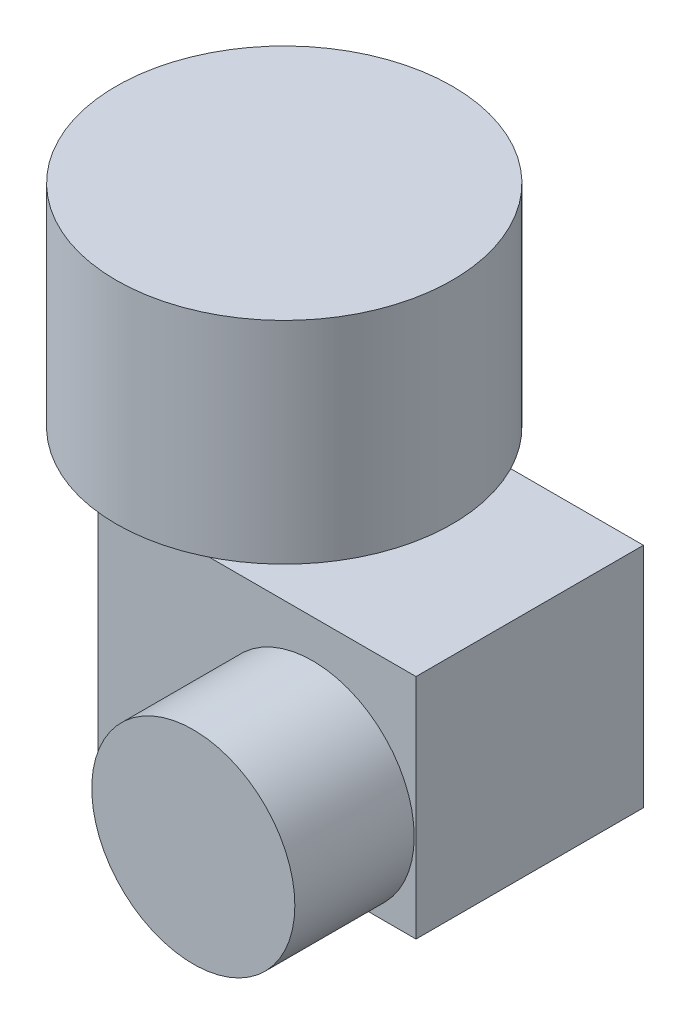
ISO-10303-21;
HEADER;
FILE_DESCRIPTION(('STEP AP214'),'2;1');
FILE_NAME('part.step','',(''),(''),'','','');
FILE_SCHEMA(('AUTOMOTIVE_DESIGN { 1 0 10303 214 1 1 1 1 }'));
ENDSEC;
DATA;
#1=APPLICATION_CONTEXT('core data for automotive mechanical design processes');
#2=APPLICATION_PROTOCOL_DEFINITION('international standard','automotive_design',2000,#1);
#3=PRODUCT_CONTEXT('',#1,'mechanical');
#4=PRODUCT('Part','Part','',(#3));
#5=PRODUCT_RELATED_PRODUCT_CATEGORY('part','',(#4));
#6=PRODUCT_DEFINITION_FORMATION('','',#4);
#7=PRODUCT_DEFINITION_CONTEXT('part definition',#1,'design');
#8=PRODUCT_DEFINITION('design','',#6,#7);
#9=PRODUCT_DEFINITION_SHAPE('','',#8);
#10=(LENGTH_UNIT() NAMED_UNIT(*) SI_UNIT(.MILLI.,.METRE.));
#11=(NAMED_UNIT(*) PLANE_ANGLE_UNIT() SI_UNIT($,.RADIAN.));
#12=(NAMED_UNIT(*) SI_UNIT($,.STERADIAN.) SOLID_ANGLE_UNIT());
#13=UNCERTAINTY_MEASURE_WITH_UNIT(LENGTH_MEASURE(1.E-05),#10,'distance_accuracy_value','');
#14=(GEOMETRIC_REPRESENTATION_CONTEXT(3) GLOBAL_UNCERTAINTY_ASSIGNED_CONTEXT((#13)) GLOBAL_UNIT_ASSIGNED_CONTEXT((#10,
#11,#12)) REPRESENTATION_CONTEXT('',''));
#15=CARTESIAN_POINT('',(0.,0.,0.));
#16=DIRECTION('',(0.,0.,1.));
#17=DIRECTION('',(1.,0.,0.));
#18=AXIS2_PLACEMENT_3D('',#15,#16,#17);
#19=CARTESIAN_POINT('',(-31.242,0.,0.));
#20=DIRECTION('',(0.,0.,1.));
#21=DIRECTION('',(1.,0.,0.));
#22=AXIS2_PLACEMENT_3D('',#19,#20,#21);
#23=PLANE('',#22);
#24=CARTESIAN_POINT('',(-7.62,11.176,0.));
#25=DIRECTION('',(0.,0.,1.));
#26=DIRECTION('',(1.,0.,0.));
#27=AXIS2_PLACEMENT_3D('',#24,#25,#26);
#28=CIRCLE('',#27,6.35);
#29=CARTESIAN_POINT('',(-1.27,11.176,0.));
#30=VERTEX_POINT('',#29);
#31=EDGE_CURVE('E11',#30,#30,#28,.T.);
#32=ORIENTED_EDGE('',*,*,#31,.F.);
#33=EDGE_LOOP('',(#32));
#34=FACE_BOUND('',#33,.T.);
#35=DIRECTION('',(0.,-1.,0.));
#36=VECTOR('',#35,1.);
#37=CARTESIAN_POINT('',(0.,0.,0.));
#38=LINE('',#37,#36);
#39=CARTESIAN_POINT('',(0.,22.352,0.));
#40=VERTEX_POINT('',#39);
#41=CARTESIAN_POINT('',(0.,0.,0.));
#42=VERTEX_POINT('',#41);
#43=EDGE_CURVE('E175',#40,#42,#38,.T.);
#44=ORIENTED_EDGE('',*,*,#43,.F.);
#45=DIRECTION('',(1.,0.,0.));
#46=VECTOR('',#45,1.);
#47=CARTESIAN_POINT('',(-31.242,22.352,0.));
#48=LINE('',#47,#46);
#49=CARTESIAN_POINT('',(-31.242,22.352,0.));
#50=VERTEX_POINT('',#49);
#51=EDGE_CURVE('E58',#50,#40,#48,.T.);
#52=ORIENTED_EDGE('',*,*,#51,.F.);
#53=DIRECTION('',(0.,-1.,0.));
#54=VECTOR('',#53,1.);
#55=CARTESIAN_POINT('',(-31.242,0.,0.));
#56=LINE('',#55,#54);
#57=CARTESIAN_POINT('',(-31.242,0.,0.));
#58=VERTEX_POINT('',#57);
#59=EDGE_CURVE('E179',#50,#58,#56,.T.);
#60=ORIENTED_EDGE('',*,*,#59,.T.);
#61=DIRECTION('',(1.,0.,0.));
#62=VECTOR('',#61,1.);
#63=CARTESIAN_POINT('',(-31.242,0.,0.));
#64=LINE('',#63,#62);
#65=EDGE_CURVE('E42',#58,#42,#64,.T.);
#66=ORIENTED_EDGE('',*,*,#65,.T.);
#67=EDGE_LOOP('',(#44,#52,#60,#66));
#68=FACE_BOUND('',#67,.T.);
#69=ADVANCED_FACE('F39',(#34,#68),#23,.T.);
#70=CARTESIAN_POINT('',(-31.242,22.352,0.));
#71=DIRECTION('',(0.,1.,0.));
#72=DIRECTION('',(0.,0.,1.));
#73=AXIS2_PLACEMENT_3D('',#70,#71,#72);
#74=PLANE('',#73);
#75=CARTESIAN_POINT('',(-24.13,22.352,-11.176));
#76=DIRECTION('',(0.,1.,0.));
#77=DIRECTION('',(0.,0.,1.));
#78=AXIS2_PLACEMENT_3D('',#75,#76,#77);
#79=CIRCLE('',#78,3.81);
#80=CARTESIAN_POINT('',(-24.13,22.352,-7.366));
#81=VERTEX_POINT('',#80);
#82=EDGE_CURVE('E170',#81,#81,#79,.T.);
#83=ORIENTED_EDGE('',*,*,#82,.F.);
#84=EDGE_LOOP('',(#83));
#85=FACE_BOUND('',#84,.T.);
#86=DIRECTION('',(0.,0.,1.));
#87=VECTOR('',#86,1.);
#88=CARTESIAN_POINT('',(0.,22.352,0.));
#89=LINE('',#88,#87);
#90=CARTESIAN_POINT('',(0.,22.352,-22.352));
#91=VERTEX_POINT('',#90);
#92=EDGE_CURVE('E183',#91,#40,#89,.T.);
#93=ORIENTED_EDGE('',*,*,#92,.F.);
#94=DIRECTION('',(1.,0.,0.));
#95=VECTOR('',#94,1.);
#96=CARTESIAN_POINT('',(-31.242,22.352,-22.352));
#97=LINE('',#96,#95);
#98=CARTESIAN_POINT('',(-31.242,22.352,-22.352));
#99=VERTEX_POINT('',#98);
#100=EDGE_CURVE('E76',#99,#91,#97,.T.);
#101=ORIENTED_EDGE('',*,*,#100,.F.);
#102=DIRECTION('',(0.,0.,1.));
#103=VECTOR('',#102,1.);
#104=CARTESIAN_POINT('',(-31.242,22.352,0.));
#105=LINE('',#104,#103);
#106=EDGE_CURVE('E189',#99,#50,#105,.T.);
#107=ORIENTED_EDGE('',*,*,#106,.T.);
#108=ORIENTED_EDGE('',*,*,#51,.T.);
#109=EDGE_LOOP('',(#93,#101,#107,#108));
#110=FACE_BOUND('',#109,.T.);
#111=ADVANCED_FACE('F214',(#85,#110),#74,.T.);
#112=CARTESIAN_POINT('',(-31.242,0.,-22.352));
#113=DIRECTION('',(0.,0.,-1.));
#114=DIRECTION('',(-1.,0.,0.));
#115=AXIS2_PLACEMENT_3D('',#112,#113,#114);
#116=PLANE('',#115);
#117=DIRECTION('',(0.,1.,0.));
#118=VECTOR('',#117,1.);
#119=CARTESIAN_POINT('',(0.,0.,-22.352));
#120=LINE('',#119,#118);
#121=CARTESIAN_POINT('',(0.,0.,-22.352));
#122=VERTEX_POINT('',#121);
#123=EDGE_CURVE('E199',#122,#91,#120,.T.);
#124=ORIENTED_EDGE('',*,*,#123,.F.);
#125=DIRECTION('',(1.,0.,0.));
#126=VECTOR('',#125,1.);
#127=CARTESIAN_POINT('',(-31.242,0.,-22.352));
#128=LINE('',#127,#126);
#129=CARTESIAN_POINT('',(-31.242,0.,-22.352));
#130=VERTEX_POINT('',#129);
#131=EDGE_CURVE('E208',#130,#122,#128,.T.);
#132=ORIENTED_EDGE('',*,*,#131,.F.);
#133=DIRECTION('',(0.,1.,0.));
#134=VECTOR('',#133,1.);
#135=CARTESIAN_POINT('',(-31.242,0.,-22.352));
#136=LINE('',#135,#134);
#137=EDGE_CURVE('E186',#130,#99,#136,.T.);
#138=ORIENTED_EDGE('',*,*,#137,.T.);
#139=ORIENTED_EDGE('',*,*,#100,.T.);
#140=EDGE_LOOP('',(#124,#132,#138,#139));
#141=FACE_BOUND('',#140,.T.);
#142=ADVANCED_FACE('F217',(#141),#116,.T.);
#143=CARTESIAN_POINT('',(-31.242,0.,0.));
#144=DIRECTION('',(0.,-1.,0.));
#145=DIRECTION('',(0.,0.,-1.));
#146=AXIS2_PLACEMENT_3D('',#143,#144,#145);
#147=PLANE('',#146);
#148=DIRECTION('',(0.,0.,-1.));
#149=VECTOR('',#148,1.);
#150=CARTESIAN_POINT('',(0.,0.,0.));
#151=LINE('',#150,#149);
#152=EDGE_CURVE('E195',#42,#122,#151,.T.);
#153=ORIENTED_EDGE('',*,*,#152,.F.);
#154=ORIENTED_EDGE('',*,*,#65,.F.);
#155=DIRECTION('',(0.,0.,-1.));
#156=VECTOR('',#155,1.);
#157=CARTESIAN_POINT('',(-31.242,0.,0.));
#158=LINE('',#157,#156);
#159=EDGE_CURVE('E182',#58,#130,#158,.T.);
#160=ORIENTED_EDGE('',*,*,#159,.T.);
#161=ORIENTED_EDGE('',*,*,#131,.T.);
#162=EDGE_LOOP('',(#153,#154,#160,#161));
#163=FACE_BOUND('',#162,.T.);
#164=ADVANCED_FACE('F211',(#163),#147,.T.);
#165=CARTESIAN_POINT('',(-31.242,0.,0.));
#166=DIRECTION('',(-1.,0.,0.));
#167=DIRECTION('',(0.,0.,1.));
#168=AXIS2_PLACEMENT_3D('',#165,#166,#167);
#169=PLANE('',#168);
#170=CARTESIAN_POINT('',(-31.242,11.176,-11.176));
#171=DIRECTION('',(-1.,0.,0.));
#172=DIRECTION('',(0.,0.,1.));
#173=AXIS2_PLACEMENT_3D('',#170,#171,#172);
#174=CIRCLE('',#173,3.81);
#175=CARTESIAN_POINT('',(-31.242,11.176,-7.366));
#176=VERTEX_POINT('',#175);
#177=EDGE_CURVE('E49',#176,#176,#174,.T.);
#178=ORIENTED_EDGE('',*,*,#177,.F.);
#179=EDGE_LOOP('',(#178));
#180=FACE_BOUND('',#179,.T.);
#181=ORIENTED_EDGE('',*,*,#59,.F.);
#182=ORIENTED_EDGE('',*,*,#106,.F.);
#183=ORIENTED_EDGE('',*,*,#137,.F.);
#184=ORIENTED_EDGE('',*,*,#159,.F.);
#185=EDGE_LOOP('',(#181,#182,#183,#184));
#186=FACE_BOUND('',#185,.T.);
#187=ADVANCED_FACE('F219',(#180,#186),#169,.T.);
#188=CARTESIAN_POINT('',(0.,0.,0.));
#189=DIRECTION('',(-1.,0.,0.));
#190=DIRECTION('',(0.,0.,1.));
#191=AXIS2_PLACEMENT_3D('',#188,#189,#190);
#192=PLANE('',#191);
#193=ORIENTED_EDGE('',*,*,#43,.T.);
#194=ORIENTED_EDGE('',*,*,#152,.T.);
#195=ORIENTED_EDGE('',*,*,#123,.T.);
#196=ORIENTED_EDGE('',*,*,#92,.T.);
#197=EDGE_LOOP('',(#193,#194,#195,#196));
#198=FACE_BOUND('',#197,.T.);
#199=ADVANCED_FACE('F213',(#198),#192,.F.);
#200=CARTESIAN_POINT('',(-24.13,23.4061,-11.176));
#201=DIRECTION('',(0.,-1.,0.));
#202=DIRECTION('',(0.,0.,-1.));
#203=AXIS2_PLACEMENT_3D('',#200,#201,#202);
#204=CYLINDRICAL_SURFACE('',#203,3.81);
#205=CARTESIAN_POINT('',(-24.13,23.4061,-11.176));
#206=DIRECTION('',(0.,1.,0.));
#207=DIRECTION('',(0.,0.,1.));
#208=AXIS2_PLACEMENT_3D('',#205,#206,#207);
#209=CIRCLE('',#208,3.81);
#210=CARTESIAN_POINT('',(-24.13,23.4061,-7.366));
#211=VERTEX_POINT('',#210);
#212=EDGE_CURVE('E171',#211,#211,#209,.T.);
#213=ORIENTED_EDGE('',*,*,#212,.F.);
#214=EDGE_LOOP('',(#213));
#215=FACE_BOUND('',#214,.T.);
#216=ORIENTED_EDGE('',*,*,#82,.T.);
#217=EDGE_LOOP('',(#216));
#218=FACE_BOUND('',#217,.T.);
#219=ADVANCED_FACE('F227',(#215,#218),#204,.T.);
#220=CARTESIAN_POINT('',(-28.194,25.9461,-7.112));
#221=DIRECTION('',(1.,0.,0.));
#222=DIRECTION('',(0.,0.,-1.));
#223=AXIS2_PLACEMENT_3D('',#220,#221,#222);
#224=PLANE('',#223);
#225=DIRECTION('',(0.,0.,1.));
#226=VECTOR('',#225,1.);
#227=CARTESIAN_POINT('',(-28.194,23.4061,-7.112));
#228=LINE('',#227,#226);
#229=CARTESIAN_POINT('',(-28.194,23.4061,-15.24));
#230=VERTEX_POINT('',#229);
#231=CARTESIAN_POINT('',(-28.194,23.4061,-7.112));
#232=VERTEX_POINT('',#231);
#233=EDGE_CURVE('E150',#230,#232,#228,.T.);
#234=ORIENTED_EDGE('',*,*,#233,.T.);
#235=DIRECTION('',(0.,-1.,0.));
#236=VECTOR('',#235,1.);
#237=CARTESIAN_POINT('',(-28.194,25.9461,-7.112));
#238=LINE('',#237,#236);
#239=CARTESIAN_POINT('',(-28.194,25.9461,-7.112));
#240=VERTEX_POINT('',#239);
#241=EDGE_CURVE('E123',#240,#232,#238,.T.);
#242=ORIENTED_EDGE('',*,*,#241,.F.);
#243=DIRECTION('',(0.,0.,1.));
#244=VECTOR('',#243,1.);
#245=CARTESIAN_POINT('',(-28.194,25.9461,-7.112));
#246=LINE('',#245,#244);
#247=CARTESIAN_POINT('',(-28.194,25.9461,-15.24));
#248=VERTEX_POINT('',#247);
#249=EDGE_CURVE('E116',#248,#240,#246,.T.);
#250=ORIENTED_EDGE('',*,*,#249,.F.);
#251=DIRECTION('',(0.,-1.,0.));
#252=VECTOR('',#251,1.);
#253=CARTESIAN_POINT('',(-28.194,25.9461,-15.24));
#254=LINE('',#253,#252);
#255=EDGE_CURVE('E120',#248,#230,#254,.T.);
#256=ORIENTED_EDGE('',*,*,#255,.T.);
#257=EDGE_LOOP('',(#234,#242,#250,#256));
#258=FACE_BOUND('',#257,.T.);
#259=ADVANCED_FACE('F119',(#258),#224,.F.);
#260=CARTESIAN_POINT('',(-20.066,25.9461,-7.112));
#261=DIRECTION('',(0.,0.,-1.));
#262=DIRECTION('',(-1.,0.,0.));
#263=AXIS2_PLACEMENT_3D('',#260,#261,#262);
#264=PLANE('',#263);
#265=DIRECTION('',(1.,0.,0.));
#266=VECTOR('',#265,1.);
#267=CARTESIAN_POINT('',(-20.066,23.4061,-7.112));
#268=LINE('',#267,#266);
#269=CARTESIAN_POINT('',(-20.066,23.4061,-7.112));
#270=VERTEX_POINT('',#269);
#271=EDGE_CURVE('E153',#232,#270,#268,.T.);
#272=ORIENTED_EDGE('',*,*,#271,.T.);
#273=DIRECTION('',(0.,-1.,0.));
#274=VECTOR('',#273,1.);
#275=CARTESIAN_POINT('',(-20.066,25.9461,-7.112));
#276=LINE('',#275,#274);
#277=CARTESIAN_POINT('',(-20.066,25.9461,-7.112));
#278=VERTEX_POINT('',#277);
#279=EDGE_CURVE('E164',#278,#270,#276,.T.);
#280=ORIENTED_EDGE('',*,*,#279,.F.);
#281=DIRECTION('',(1.,0.,0.));
#282=VECTOR('',#281,1.);
#283=CARTESIAN_POINT('',(-20.066,25.9461,-7.112));
#284=LINE('',#283,#282);
#285=EDGE_CURVE('E128',#240,#278,#284,.T.);
#286=ORIENTED_EDGE('',*,*,#285,.F.);
#287=ORIENTED_EDGE('',*,*,#241,.T.);
#288=EDGE_LOOP('',(#272,#280,#286,#287));
#289=FACE_BOUND('',#288,.T.);
#290=ADVANCED_FACE('F282',(#289),#264,.F.);
#291=CARTESIAN_POINT('',(-20.066,25.9461,-7.112));
#292=DIRECTION('',(-1.,0.,0.));
#293=DIRECTION('',(0.,0.,1.));
#294=AXIS2_PLACEMENT_3D('',#291,#292,#293);
#295=PLANE('',#294);
#296=DIRECTION('',(0.,0.,-1.));
#297=VECTOR('',#296,1.);
#298=CARTESIAN_POINT('',(-20.066,23.4061,-7.112));
#299=LINE('',#298,#297);
#300=CARTESIAN_POINT('',(-20.066,23.4061,-15.24));
#301=VERTEX_POINT('',#300);
#302=EDGE_CURVE('E157',#270,#301,#299,.T.);
#303=ORIENTED_EDGE('',*,*,#302,.T.);
#304=DIRECTION('',(0.,-1.,0.));
#305=VECTOR('',#304,1.);
#306=CARTESIAN_POINT('',(-20.066,25.9461,-15.24));
#307=LINE('',#306,#305);
#308=CARTESIAN_POINT('',(-20.066,25.9461,-15.24));
#309=VERTEX_POINT('',#308);
#310=EDGE_CURVE('E139',#309,#301,#307,.T.);
#311=ORIENTED_EDGE('',*,*,#310,.F.);
#312=DIRECTION('',(0.,0.,-1.));
#313=VECTOR('',#312,1.);
#314=CARTESIAN_POINT('',(-20.066,25.9461,-7.112));
#315=LINE('',#314,#313);
#316=EDGE_CURVE('E143',#278,#309,#315,.T.);
#317=ORIENTED_EDGE('',*,*,#316,.F.);
#318=ORIENTED_EDGE('',*,*,#279,.T.);
#319=EDGE_LOOP('',(#303,#311,#317,#318));
#320=FACE_BOUND('',#319,.T.);
#321=ADVANCED_FACE('F279',(#320),#295,.F.);
#322=CARTESIAN_POINT('',(-20.066,25.9461,-15.24));
#323=DIRECTION('',(0.,0.,1.));
#324=DIRECTION('',(1.,0.,0.));
#325=AXIS2_PLACEMENT_3D('',#322,#323,#324);
#326=PLANE('',#325);
#327=DIRECTION('',(-1.,0.,0.));
#328=VECTOR('',#327,1.);
#329=CARTESIAN_POINT('',(-20.066,23.4061,-15.24));
#330=LINE('',#329,#328);
#331=EDGE_CURVE('E129',#301,#230,#330,.T.);
#332=ORIENTED_EDGE('',*,*,#331,.T.);
#333=ORIENTED_EDGE('',*,*,#255,.F.);
#334=DIRECTION('',(-1.,0.,0.));
#335=VECTOR('',#334,1.);
#336=CARTESIAN_POINT('',(-20.066,25.9461,-15.24));
#337=LINE('',#336,#335);
#338=EDGE_CURVE('E135',#309,#248,#337,.T.);
#339=ORIENTED_EDGE('',*,*,#338,.F.);
#340=ORIENTED_EDGE('',*,*,#310,.T.);
#341=EDGE_LOOP('',(#332,#333,#339,#340));
#342=FACE_BOUND('',#341,.T.);
#343=ADVANCED_FACE('F133',(#342),#326,.F.);
#344=CARTESIAN_POINT('',(0.,23.4061,0.));
#345=DIRECTION('',(0.,1.,0.));
#346=DIRECTION('',(0.,0.,1.));
#347=AXIS2_PLACEMENT_3D('',#344,#345,#346);
#348=PLANE('',#347);
#349=ORIENTED_EDGE('',*,*,#212,.T.);
#350=EDGE_LOOP('',(#349));
#351=FACE_BOUND('',#350,.T.);
#352=ORIENTED_EDGE('',*,*,#233,.F.);
#353=ORIENTED_EDGE('',*,*,#331,.F.);
#354=ORIENTED_EDGE('',*,*,#302,.F.);
#355=ORIENTED_EDGE('',*,*,#271,.F.);
#356=EDGE_LOOP('',(#352,#353,#354,#355));
#357=FACE_BOUND('',#356,.T.);
#358=ADVANCED_FACE('F269',(#351,#357),#348,.F.);
#359=CARTESIAN_POINT('',(-24.13,25.9461,-11.176));
#360=DIRECTION('',(0.,1.,0.));
#361=DIRECTION('',(0.,0.,1.));
#362=AXIS2_PLACEMENT_3D('',#359,#360,#361);
#363=PLANE('',#362);
#364=CARTESIAN_POINT('',(-24.13,25.9461,-11.176));
#365=DIRECTION('',(0.,1.,0.));
#366=DIRECTION('',(0.,0.,1.));
#367=AXIS2_PLACEMENT_3D('',#364,#365,#366);
#368=CIRCLE('',#367,16.5227);
#369=CARTESIAN_POINT('',(-24.13,25.9461,-27.6987));
#370=VERTEX_POINT('',#369);
#371=EDGE_CURVE('E299',#370,#370,#368,.T.);
#372=ORIENTED_EDGE('',*,*,#371,.F.);
#373=EDGE_LOOP('',(#372));
#374=FACE_BOUND('',#373,.T.);
#375=ORIENTED_EDGE('',*,*,#338,.T.);
#376=ORIENTED_EDGE('',*,*,#249,.T.);
#377=ORIENTED_EDGE('',*,*,#285,.T.);
#378=ORIENTED_EDGE('',*,*,#316,.T.);
#379=EDGE_LOOP('',(#375,#376,#377,#378));
#380=FACE_BOUND('',#379,.T.);
#381=ADVANCED_FACE('F141',(#374,#380),#363,.F.);
#382=CARTESIAN_POINT('',(-24.13,46.6979,-11.176));
#383=DIRECTION('',(0.,-1.,0.));
#384=DIRECTION('',(0.,0.,-1.));
#385=AXIS2_PLACEMENT_3D('',#382,#383,#384);
#386=CYLINDRICAL_SURFACE('',#385,16.5227);
#387=CARTESIAN_POINT('',(-24.13,46.6979,-11.176));
#388=DIRECTION('',(0.,1.,0.));
#389=DIRECTION('',(0.,0.,1.));
#390=AXIS2_PLACEMENT_3D('',#387,#388,#389);
#391=CIRCLE('',#390,16.5227);
#392=CARTESIAN_POINT('',(-24.13,46.6979,-27.6987));
#393=VERTEX_POINT('',#392);
#394=EDGE_CURVE('E154',#393,#393,#391,.T.);
#395=CARTESIAN_POINT('',(-24.13,46.6979,-27.6987));
#396=CARTESIAN_POINT('',(-24.13,46.4817354166667,-27.6987));
#397=CARTESIAN_POINT('',(-24.13,46.2655708333333,-27.6987));
#398=CARTESIAN_POINT('',(-24.13,45.8332416666667,-27.6987));
#399=CARTESIAN_POINT('',(-24.13,45.6170770833333,-27.6987));
#400=CARTESIAN_POINT('',(-24.13,45.1847479166667,-27.6987));
#401=CARTESIAN_POINT('',(-24.13,44.9685833333333,-27.6987));
#402=CARTESIAN_POINT('',(-24.13,44.5362541666667,-27.6987));
#403=CARTESIAN_POINT('',(-24.13,44.3200895833333,-27.6987));
#404=CARTESIAN_POINT('',(-24.13,43.8877604166667,-27.6987));
#405=CARTESIAN_POINT('',(-24.13,43.6715958333333,-27.6987));
#406=CARTESIAN_POINT('',(-24.13,43.2392666666667,-27.6987));
#407=CARTESIAN_POINT('',(-24.13,43.0231020833333,-27.6987));
#408=CARTESIAN_POINT('',(-24.13,42.5907729166667,-27.6987));
#409=CARTESIAN_POINT('',(-24.13,42.3746083333333,-27.6987));
#410=CARTESIAN_POINT('',(-24.13,41.9422791666667,-27.6987));
#411=CARTESIAN_POINT('',(-24.13,41.7261145833333,-27.6987));
#412=CARTESIAN_POINT('',(-24.13,41.2937854166667,-27.6987));
#413=CARTESIAN_POINT('',(-24.13,41.0776208333333,-27.6987));
#414=CARTESIAN_POINT('',(-24.13,40.6452916666667,-27.6987));
#415=CARTESIAN_POINT('',(-24.13,40.4291270833333,-27.6987));
#416=CARTESIAN_POINT('',(-24.13,39.9967979166667,-27.6987));
#417=CARTESIAN_POINT('',(-24.13,39.7806333333333,-27.6987));
#418=CARTESIAN_POINT('',(-24.13,39.3483041666667,-27.6987));
#419=CARTESIAN_POINT('',(-24.13,39.1321395833333,-27.6987));
#420=CARTESIAN_POINT('',(-24.13,38.6998104166667,-27.6987));
#421=CARTESIAN_POINT('',(-24.13,38.4836458333333,-27.6987));
#422=CARTESIAN_POINT('',(-24.13,38.0513166666667,-27.6987));
#423=CARTESIAN_POINT('',(-24.13,37.8351520833333,-27.6987));
#424=CARTESIAN_POINT('',(-24.13,37.4028229166667,-27.6987));
#425=CARTESIAN_POINT('',(-24.13,37.1866583333333,-27.6987));
#426=CARTESIAN_POINT('',(-24.13,36.7543291666667,-27.6987));
#427=CARTESIAN_POINT('',(-24.13,36.5381645833333,-27.6987));
#428=CARTESIAN_POINT('',(-24.13,36.1058354166667,-27.6987));
#429=CARTESIAN_POINT('',(-24.13,35.8896708333333,-27.6987));
#430=CARTESIAN_POINT('',(-24.13,35.4573416666667,-27.6987));
#431=CARTESIAN_POINT('',(-24.13,35.2411770833333,-27.6987));
#432=CARTESIAN_POINT('',(-24.13,34.8088479166667,-27.6987));
#433=CARTESIAN_POINT('',(-24.13,34.5926833333333,-27.6987));
#434=CARTESIAN_POINT('',(-24.13,34.1603541666667,-27.6987));
#435=CARTESIAN_POINT('',(-24.13,33.9441895833333,-27.6987));
#436=CARTESIAN_POINT('',(-24.13,33.5118604166667,-27.6987));
#437=CARTESIAN_POINT('',(-24.13,33.2956958333333,-27.6987));
#438=CARTESIAN_POINT('',(-24.13,32.8633666666667,-27.6987));
#439=CARTESIAN_POINT('',(-24.13,32.6472020833333,-27.6987));
#440=CARTESIAN_POINT('',(-24.13,32.2148729166667,-27.6987));
#441=CARTESIAN_POINT('',(-24.13,31.9987083333333,-27.6987));
#442=CARTESIAN_POINT('',(-24.13,31.5663791666667,-27.6987));
#443=CARTESIAN_POINT('',(-24.13,31.3502145833333,-27.6987));
#444=CARTESIAN_POINT('',(-24.13,30.9178854166667,-27.6987));
#445=CARTESIAN_POINT('',(-24.13,30.7017208333333,-27.6987));
#446=CARTESIAN_POINT('',(-24.13,30.2693916666667,-27.6987));
#447=CARTESIAN_POINT('',(-24.13,30.0532270833333,-27.6987));
#448=CARTESIAN_POINT('',(-24.13,29.6208979166667,-27.6987));
#449=CARTESIAN_POINT('',(-24.13,29.4047333333333,-27.6987));
#450=CARTESIAN_POINT('',(-24.13,28.9724041666667,-27.6987));
#451=CARTESIAN_POINT('',(-24.13,28.7562395833333,-27.6987));
#452=CARTESIAN_POINT('',(-24.13,28.3239104166667,-27.6987));
#453=CARTESIAN_POINT('',(-24.13,28.1077458333333,-27.6987));
#454=CARTESIAN_POINT('',(-24.13,27.6754166666667,-27.6987));
#455=CARTESIAN_POINT('',(-24.13,27.4592520833333,-27.6987));
#456=CARTESIAN_POINT('',(-24.13,27.0269229166667,-27.6987));
#457=CARTESIAN_POINT('',(-24.13,26.8107583333333,-27.6987));
#458=CARTESIAN_POINT('',(-24.13,26.3784291666667,-27.6987));
#459=CARTESIAN_POINT('',(-24.13,26.1622645833333,-27.6987));
#460=CARTESIAN_POINT('',(-24.13,25.9461,-27.6987));
#461=B_SPLINE_CURVE_WITH_KNOTS('',3,(#395,#396,#397,#398,#399,#400,#401,#402,#403,#404,#405,
#406,#407,#408,#409,#410,#411,#412,#413,#414,#415,#416,#417,#418,#419,#420,#421,#422,#423,#424,
#425,#426,#427,#428,#429,#430,#431,#432,#433,#434,#435,#436,#437,#438,#439,#440,#441,#442,#443,
#444,#445,#446,#447,#448,#449,#450,#451,#452,#453,#454,#455,#456,#457,#458,#459,#460),
.UNSPECIFIED.,.F.,.F.,(4,2,2,2,2,2,2,2,2,2,2,2,2,2,2,2,2,2,2,2,2,2,2,2,2,2,2,2,2,2,2,2,4),(0.,
0.64849375,1.2969875,1.94548125,2.593975,3.24246875,3.8909625,4.53945625,5.18795,5.83644375,
6.4849375,7.13343125,7.78192499999999,8.43041874999999,9.07891249999999,9.72740624999999,
10.3759,11.02439375,11.6728875,12.32138125,12.969875,13.61836875,14.2668625,14.91535625,
15.56385,16.21234375,16.8608375,17.50933125,18.157825,18.80631875,19.4548125,20.10330625,
20.7518),.UNSPECIFIED.);
#462=EDGE_CURVE('BSEAM265',#393,#370,#461,.T.);
#463=ORIENTED_EDGE('',*,*,#394,.F.);
#464=ORIENTED_EDGE('',*,*,#371,.T.);
#465=ORIENTED_EDGE('',*,*,#462,.T.);
#466=ORIENTED_EDGE('',*,*,#462,.F.);
#467=EDGE_LOOP('',(#463,#465,#464,#466));
#468=FACE_BOUND('',#467,.T.);
#469=ADVANCED_FACE('F265',(#468),#386,.T.);
#470=CARTESIAN_POINT('',(-24.13,46.6979,-11.176));
#471=DIRECTION('',(0.,1.,0.));
#472=DIRECTION('',(0.,0.,1.));
#473=AXIS2_PLACEMENT_3D('',#470,#471,#472);
#474=PLANE('',#473);
#475=ORIENTED_EDGE('',*,*,#394,.T.);
#476=EDGE_LOOP('',(#475));
#477=FACE_BOUND('',#476,.T.);
#478=ADVANCED_FACE('F261',(#477),#474,.T.);
#479=CARTESIAN_POINT('',(-33.3502,11.176,-11.176));
#480=DIRECTION('',(1.,0.,0.));
#481=DIRECTION('',(0.,0.,-1.));
#482=AXIS2_PLACEMENT_3D('',#479,#480,#481);
#483=CYLINDRICAL_SURFACE('',#482,3.81);
#484=CARTESIAN_POINT('',(-33.3502,11.176,-11.176));
#485=DIRECTION('',(-1.,0.,0.));
#486=DIRECTION('',(0.,0.,1.));
#487=AXIS2_PLACEMENT_3D('',#484,#485,#486);
#488=CIRCLE('',#487,3.81);
#489=CARTESIAN_POINT('',(-33.3502,11.176,-7.366));
#490=VERTEX_POINT('',#489);
#491=EDGE_CURVE('E303',#490,#490,#488,.T.);
#492=ORIENTED_EDGE('',*,*,#491,.F.);
#493=EDGE_LOOP('',(#492));
#494=FACE_BOUND('',#493,.T.);
#495=ORIENTED_EDGE('',*,*,#177,.T.);
#496=EDGE_LOOP('',(#495));
#497=FACE_BOUND('',#496,.T.);
#498=ADVANCED_FACE('F253',(#494,#497),#483,.T.);
#499=CARTESIAN_POINT('',(-33.3502,11.176,-11.176));
#500=DIRECTION('',(-1.,0.,0.));
#501=DIRECTION('',(0.,0.,1.));
#502=AXIS2_PLACEMENT_3D('',#499,#500,#501);
#503=PLANE('',#502);
#504=ORIENTED_EDGE('',*,*,#491,.T.);
#505=EDGE_LOOP('',(#504));
#506=FACE_BOUND('',#505,.T.);
#507=ADVANCED_FACE('F243',(#506),#503,.T.);
#508=CARTESIAN_POINT('',(-7.62,11.176,2.54));
#509=DIRECTION('',(0.,0.,-1.));
#510=DIRECTION('',(-1.,0.,0.));
#511=AXIS2_PLACEMENT_3D('',#508,#509,#510);
#512=CYLINDRICAL_SURFACE('',#511,6.35);
#513=CARTESIAN_POINT('',(-7.62,11.176,2.54));
#514=DIRECTION('',(0.,0.,1.));
#515=DIRECTION('',(1.,0.,0.));
#516=AXIS2_PLACEMENT_3D('',#513,#514,#515);
#517=CIRCLE('',#516,6.35);
#518=CARTESIAN_POINT('',(-1.27,11.176,2.54));
#519=VERTEX_POINT('',#518);
#520=EDGE_CURVE('E312',#519,#519,#517,.T.);
#521=ORIENTED_EDGE('',*,*,#520,.F.);
#522=EDGE_LOOP('',(#521));
#523=FACE_BOUND('',#522,.T.);
#524=ORIENTED_EDGE('',*,*,#31,.T.);
#525=EDGE_LOOP('',(#524));
#526=FACE_BOUND('',#525,.T.);
#527=ADVANCED_FACE('F240',(#523,#526),#512,.T.);
#528=CARTESIAN_POINT('',(-7.62,11.176,14.2748));
#529=DIRECTION('',(0.,0.,-1.));
#530=DIRECTION('',(-1.,0.,0.));
#531=AXIS2_PLACEMENT_3D('',#528,#529,#530);
#532=CYLINDRICAL_SURFACE('',#531,9.9822);
#533=CARTESIAN_POINT('',(-7.62,11.176,14.2748));
#534=DIRECTION('',(0.,0.,1.));
#535=DIRECTION('',(1.,0.,0.));
#536=AXIS2_PLACEMENT_3D('',#533,#534,#535);
#537=CIRCLE('',#536,9.9822);
#538=CARTESIAN_POINT('',(2.3622,11.176,14.2748));
#539=VERTEX_POINT('',#538);
#540=EDGE_CURVE('E317',#539,#539,#537,.T.);
#541=ORIENTED_EDGE('',*,*,#540,.F.);
#542=EDGE_LOOP('',(#541));
#543=FACE_BOUND('',#542,.T.);
#544=CARTESIAN_POINT('',(-7.62,11.176,2.54));
#545=DIRECTION('',(0.,0.,1.));
#546=DIRECTION('',(1.,0.,0.));
#547=AXIS2_PLACEMENT_3D('',#544,#545,#546);
#548=CIRCLE('',#547,9.9822);
#549=CARTESIAN_POINT('',(2.3622,11.176,2.54));
#550=VERTEX_POINT('',#549);
#551=EDGE_CURVE('E318',#550,#550,#548,.T.);
#552=ORIENTED_EDGE('',*,*,#551,.T.);
#553=EDGE_LOOP('',(#552));
#554=FACE_BOUND('',#553,.T.);
#555=ADVANCED_FACE('F242',(#543,#554),#532,.T.);
#556=CARTESIAN_POINT('',(-7.62,11.176,14.2748));
#557=DIRECTION('',(0.,0.,1.));
#558=DIRECTION('',(1.,0.,0.));
#559=AXIS2_PLACEMENT_3D('',#556,#557,#558);
#560=PLANE('',#559);
#561=ORIENTED_EDGE('',*,*,#540,.T.);
#562=EDGE_LOOP('',(#561));
#563=FACE_BOUND('',#562,.T.);
#564=ADVANCED_FACE('F250',(#563),#560,.T.);
#565=CARTESIAN_POINT('',(-7.62,11.176,2.54));
#566=DIRECTION('',(0.,0.,1.));
#567=DIRECTION('',(1.,0.,0.));
#568=AXIS2_PLACEMENT_3D('',#565,#566,#567);
#569=PLANE('',#568);
#570=ORIENTED_EDGE('',*,*,#520,.T.);
#571=EDGE_LOOP('',(#570));
#572=FACE_BOUND('',#571,.T.);
#573=ORIENTED_EDGE('',*,*,#551,.F.);
#574=EDGE_LOOP('',(#573));
#575=FACE_BOUND('',#574,.T.);
#576=ADVANCED_FACE('F329',(#572,#575),#569,.F.);
#577=CLOSED_SHELL('',(#69,#111,#142,#164,#187,#199,#219,#259,#290,#321,#343,#358,#381,#469,#478,
#498,#507,#527,#555,#564,#576));
#578=MANIFOLD_SOLID_BREP('B2',#577);
#579=ADVANCED_BREP_SHAPE_REPRESENTATION('',(#18,#578),#14);
#580=SHAPE_DEFINITION_REPRESENTATION(#9,#579);
ENDSEC;
END-ISO-10303-21;
